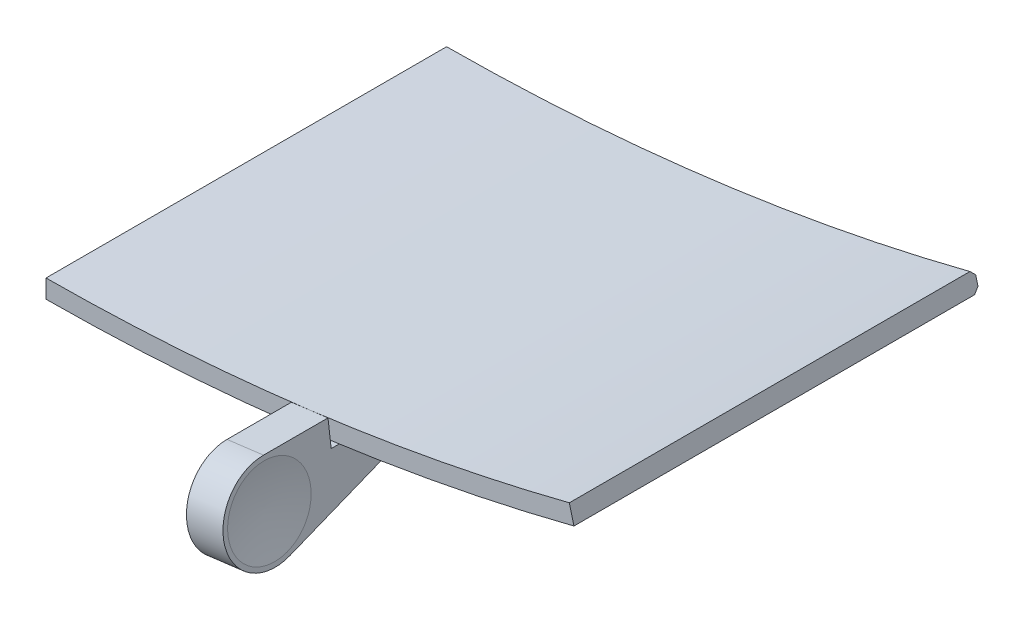
ISO-10303-21;
HEADER;
FILE_DESCRIPTION(('STEP AP214'),'2;1');
FILE_NAME('part.step','',(''),(''),'','','');
FILE_SCHEMA(('AUTOMOTIVE_DESIGN { 1 0 10303 214 1 1 1 1 }'));
ENDSEC;
DATA;
#1=APPLICATION_CONTEXT('core data for automotive mechanical design processes');
#2=APPLICATION_PROTOCOL_DEFINITION('international standard','automotive_design',2000,#1);
#3=PRODUCT_CONTEXT('',#1,'mechanical');
#4=PRODUCT('Part','Part','',(#3));
#5=PRODUCT_RELATED_PRODUCT_CATEGORY('part','',(#4));
#6=PRODUCT_DEFINITION_FORMATION('','',#4);
#7=PRODUCT_DEFINITION_CONTEXT('part definition',#1,'design');
#8=PRODUCT_DEFINITION('design','',#6,#7);
#9=PRODUCT_DEFINITION_SHAPE('','',#8);
#10=(LENGTH_UNIT() NAMED_UNIT(*) SI_UNIT(.MILLI.,.METRE.));
#11=(NAMED_UNIT(*) PLANE_ANGLE_UNIT() SI_UNIT($,.RADIAN.));
#12=(NAMED_UNIT(*) SI_UNIT($,.STERADIAN.) SOLID_ANGLE_UNIT());
#13=UNCERTAINTY_MEASURE_WITH_UNIT(LENGTH_MEASURE(1.E-05),#10,'distance_accuracy_value','');
#14=(GEOMETRIC_REPRESENTATION_CONTEXT(3) GLOBAL_UNCERTAINTY_ASSIGNED_CONTEXT((#13)) GLOBAL_UNIT_ASSIGNED_CONTEXT((#10,
#11,#12)) REPRESENTATION_CONTEXT('',''));
#15=CARTESIAN_POINT('',(0.,0.,0.));
#16=DIRECTION('',(0.,0.,1.));
#17=DIRECTION('',(1.,0.,0.));
#18=AXIS2_PLACEMENT_3D('',#15,#16,#17);
#19=CARTESIAN_POINT('',(0.,0.,44.));
#20=DIRECTION('',(0.,0.,1.));
#21=DIRECTION('',(1.,0.,0.));
#22=AXIS2_PLACEMENT_3D('',#19,#20,#21);
#23=PLANE('',#22);
#24=DIRECTION('',(-0.991905527292072,-0.126978048998387,0.));
#25=VECTOR('',#24,1.);
#26=CARTESIAN_POINT('',(31.8236525692054,-232.843842815643,44.));
#27=LINE('',#26,#25);
#28=CARTESIAN_POINT('',(31.8236525692054,-232.843842815643,44.));
#29=VERTEX_POINT('',#28);
#30=CARTESIAN_POINT('',(29.8398415146213,-233.097798913639,44.));
#31=VERTEX_POINT('',#30);
#32=EDGE_CURVE('E65',#29,#31,#27,.T.);
#33=ORIENTED_EDGE('',*,*,#32,.F.);
#34=DIRECTION('',(0.126978048998387,-0.991905527292072,0.));
#35=VECTOR('',#34,1.);
#36=CARTESIAN_POINT('',(32.1704258400996,-235.552707275527,44.));
#37=LINE('',#36,#35);
#38=CARTESIAN_POINT('',(32.0765371034071,-234.819283210419,44.));
#39=VERTEX_POINT('',#38);
#40=EDGE_CURVE('E183',#29,#39,#37,.T.);
#41=ORIENTED_EDGE('',*,*,#40,.T.);
#42=CARTESIAN_POINT('',(0.,0.,44.));
#43=DIRECTION('',(0.,0.,1.));
#44=DIRECTION('',(1.,0.,0.));
#45=AXIS2_PLACEMENT_3D('',#42,#43,#44);
#46=CIRCLE('',#45,237.000000000002);
#47=CARTESIAN_POINT('',(58.5383393260251,-229.65683710474,44.));
#48=VERTEX_POINT('',#47);
#49=EDGE_CURVE('E471',#39,#48,#46,.T.);
#50=ORIENTED_EDGE('',*,*,#49,.T.);
#51=DIRECTION('',(0.251900457292527,-0.967753150145126,0.));
#52=VECTOR('',#51,1.);
#53=CARTESIAN_POINT('',(58.0345318984008,-227.721305782605,44.));
#54=LINE('',#53,#52);
#55=CARTESIAN_POINT('',(58.0345318984008,-227.721305782605,44.));
#56=VERTEX_POINT('',#55);
#57=EDGE_CURVE('E227',#56,#48,#54,.T.);
#58=ORIENTED_EDGE('',*,*,#57,.F.);
#59=CARTESIAN_POINT('',(0.,0.,44.));
#60=DIRECTION('',(0.,0.,-1.));
#61=DIRECTION('',(1.,0.,0.));
#62=AXIS2_PLACEMENT_3D('',#59,#60,#61);
#63=CIRCLE('',#62,235.000000000003);
#64=EDGE_CURVE('E480',#56,#31,#63,.T.);
#65=ORIENTED_EDGE('',*,*,#64,.T.);
#66=EDGE_LOOP('',(#33,#41,#50,#58,#65));
#67=FACE_BOUND('',#66,.T.);
#68=ADVANCED_FACE('F47',(#67),#23,.T.);
#69=CARTESIAN_POINT('',(0.,0.,44.));
#70=DIRECTION('',(0.,0.,-1.));
#71=DIRECTION('',(-1.,0.,0.));
#72=AXIS2_PLACEMENT_3D('',#69,#70,#71);
#73=CYLINDRICAL_SURFACE('',#72,235.000000000003);
#74=CARTESIAN_POINT('',(0.,0.,0.500000000000056));
#75=DIRECTION('',(0.,0.,1.));
#76=DIRECTION('',(1.,0.,0.));
#77=AXIS2_PLACEMENT_3D('',#74,#75,#76);
#78=CIRCLE('',#77,235.000000000003);
#79=CARTESIAN_POINT('',(58.0345318984008,-227.721305782605,0.500000000000071));
#80=VERTEX_POINT('',#79);
#81=CARTESIAN_POINT('',(1.2,-234.996936150243,0.500000000000071));
#82=VERTEX_POINT('',#81);
#83=EDGE_CURVE('E282',#80,#82,#78,.F.);
#84=ORIENTED_EDGE('',*,*,#83,.T.);
#85=DIRECTION('',(0.,0.,1.));
#86=VECTOR('',#85,1.);
#87=CARTESIAN_POINT('',(1.2,-234.996936150243,0.));
#88=LINE('',#87,#86);
#89=CARTESIAN_POINT('',(1.2,-234.996936150243,44.));
#90=VERTEX_POINT('',#89);
#91=EDGE_CURVE('E228',#82,#90,#88,.T.);
#92=ORIENTED_EDGE('',*,*,#91,.T.);
#93=EDGE_CURVE('E456',#31,#90,#63,.T.);
#94=ORIENTED_EDGE('',*,*,#93,.F.);
#95=ORIENTED_EDGE('',*,*,#64,.F.);
#96=DIRECTION('',(0.,0.,1.));
#97=VECTOR('',#96,1.);
#98=CARTESIAN_POINT('',(58.0345318984008,-227.721305782605,0.));
#99=LINE('',#98,#97);
#100=EDGE_CURVE('E235',#80,#56,#99,.T.);
#101=ORIENTED_EDGE('',*,*,#100,.F.);
#102=EDGE_LOOP('',(#84,#92,#94,#95,#101));
#103=FACE_BOUND('',#102,.T.);
#104=ADVANCED_FACE('F295',(#103),#73,.F.);
#105=CARTESIAN_POINT('',(0.,0.,44.));
#106=DIRECTION('',(0.,0.,-1.));
#107=DIRECTION('',(-1.,0.,0.));
#108=AXIS2_PLACEMENT_3D('',#105,#106,#107);
#109=CYLINDRICAL_SURFACE('',#108,237.000000000002);
#110=CARTESIAN_POINT('',(1.2,-236.996962005849,44.));
#111=VERTEX_POINT('',#110);
#112=CARTESIAN_POINT('',(28.1089149942388,-235.327195406412,44.));
#113=VERTEX_POINT('',#112);
#114=EDGE_CURVE('E463',#111,#113,#46,.T.);
#115=ORIENTED_EDGE('',*,*,#114,.F.);
#116=DIRECTION('',(0.,0.,1.));
#117=VECTOR('',#116,1.);
#118=CARTESIAN_POINT('',(1.2,-236.996962005849,0.));
#119=LINE('',#118,#117);
#120=CARTESIAN_POINT('',(1.2,-236.996962005849,0.50000000000161));
#121=VERTEX_POINT('',#120);
#122=EDGE_CURVE('E222',#121,#111,#119,.T.);
#123=ORIENTED_EDGE('',*,*,#122,.F.);
#124=CARTESIAN_POINT('',(0.,0.,0.500000000000056));
#125=DIRECTION('',(0.,0.,1.));
#126=DIRECTION('',(1.,0.,0.));
#127=AXIS2_PLACEMENT_3D('',#124,#125,#126);
#128=CIRCLE('',#127,237.000000000002);
#129=CARTESIAN_POINT('',(58.5383393260246,-229.656837104738,0.500000000000056));
#130=VERTEX_POINT('',#129);
#131=EDGE_CURVE('E467',#121,#130,#128,.T.);
#132=ORIENTED_EDGE('',*,*,#131,.T.);
#133=DIRECTION('',(0.,0.,1.));
#134=VECTOR('',#133,1.);
#135=CARTESIAN_POINT('',(58.5383393260251,-229.65683710474,0.));
#136=LINE('',#135,#134);
#137=EDGE_CURVE('E205',#130,#48,#136,.T.);
#138=ORIENTED_EDGE('',*,*,#137,.T.);
#139=ORIENTED_EDGE('',*,*,#49,.F.);
#140=EDGE_CURVE('E469',#113,#39,#46,.T.);
#141=ORIENTED_EDGE('',*,*,#140,.F.);
#142=EDGE_LOOP('',(#115,#123,#132,#138,#139,#141));
#143=FACE_BOUND('',#142,.T.);
#144=ADVANCED_FACE('F299',(#143),#109,.T.);
#145=DIRECTION('',(-0.991905527292072,-0.126978048998387,0.));
#146=VECTOR('',#145,1.);
#147=CARTESIAN_POINT('',(29.8398415146213,-233.097798913639,44.));
#148=LINE('',#147,#146);
#149=CARTESIAN_POINT('',(27.8560304600371,-233.351755011636,44.));
#150=VERTEX_POINT('',#149);
#151=EDGE_CURVE('E11',#31,#150,#148,.T.);
#152=ORIENTED_EDGE('',*,*,#151,.F.);
#153=ORIENTED_EDGE('',*,*,#93,.T.);
#154=DIRECTION('',(0.,1.,0.));
#155=VECTOR('',#154,1.);
#156=CARTESIAN_POINT('',(1.2,-234.996936150243,44.));
#157=LINE('',#156,#155);
#158=EDGE_CURVE('E223',#111,#90,#157,.T.);
#159=ORIENTED_EDGE('',*,*,#158,.F.);
#160=ORIENTED_EDGE('',*,*,#114,.T.);
#161=DIRECTION('',(0.126978048998387,-0.991905527292072,0.));
#162=VECTOR('',#161,1.);
#163=CARTESIAN_POINT('',(28.2028037309314,-236.06061947152,44.));
#164=LINE('',#163,#162);
#165=EDGE_CURVE('E73',#150,#113,#164,.T.);
#166=ORIENTED_EDGE('',*,*,#165,.F.);
#167=EDGE_LOOP('',(#152,#153,#159,#160,#166));
#168=FACE_BOUND('',#167,.T.);
#169=ADVANCED_FACE('F271',(#168),#23,.T.);
#170=CARTESIAN_POINT('',(0.,0.,0.));
#171=DIRECTION('',(0.,0.,1.));
#172=DIRECTION('',(1.,0.,0.));
#173=AXIS2_PLACEMENT_3D('',#170,#171,#172);
#174=PLANE('',#173);
#175=CARTESIAN_POINT('',(0.,0.,0.));
#176=DIRECTION('',(0.,0.,1.));
#177=DIRECTION('',(1.,0.,0.));
#178=AXIS2_PLACEMENT_3D('',#175,#176,#177);
#179=CIRCLE('',#178,236.500000000002);
#180=CARTESIAN_POINT('',(58.412387479446,-229.172954313881,0.));
#181=VERTEX_POINT('',#180);
#182=CARTESIAN_POINT('',(1.2,-236.496955582944,0.));
#183=VERTEX_POINT('',#182);
#184=EDGE_CURVE('E460',#181,#183,#179,.F.);
#185=ORIENTED_EDGE('',*,*,#184,.T.);
#186=DIRECTION('',(0.,1.,0.));
#187=VECTOR('',#186,1.);
#188=CARTESIAN_POINT('',(1.2,-234.996936150243,0.));
#189=LINE('',#188,#187);
#190=CARTESIAN_POINT('',(1.2,-235.496942655316,0.));
#191=VERTEX_POINT('',#190);
#192=EDGE_CURVE('E218',#183,#191,#189,.T.);
#193=ORIENTED_EDGE('',*,*,#192,.T.);
#194=CARTESIAN_POINT('',(0.,0.,0.));
#195=DIRECTION('',(0.,0.,1.));
#196=DIRECTION('',(1.,0.,0.));
#197=AXIS2_PLACEMENT_3D('',#194,#195,#196);
#198=CIRCLE('',#197,235.500000000003);
#199=CARTESIAN_POINT('',(58.160483765678,-228.205188652983,0.));
#200=VERTEX_POINT('',#199);
#201=EDGE_CURVE('E458',#191,#200,#198,.T.);
#202=ORIENTED_EDGE('',*,*,#201,.T.);
#203=DIRECTION('',(0.251900457292527,-0.967753150145126,0.));
#204=VECTOR('',#203,1.);
#205=CARTESIAN_POINT('',(58.0345318984008,-227.721305782605,0.));
#206=LINE('',#205,#204);
#207=EDGE_CURVE('E238',#200,#181,#206,.T.);
#208=ORIENTED_EDGE('',*,*,#207,.T.);
#209=EDGE_LOOP('',(#185,#193,#202,#208));
#210=FACE_BOUND('',#209,.T.);
#211=ADVANCED_FACE('F303',(#210),#174,.F.);
#212=CARTESIAN_POINT('',(0.,0.,0.500000000000056));
#213=DIRECTION('',(0.,0.,-1.));
#214=DIRECTION('',(-1.,0.,0.));
#215=AXIS2_PLACEMENT_3D('',#212,#213,#214);
#216=CONICAL_SURFACE('',#215,235.000000000003,0.785398163397421);
#217=CARTESIAN_POINT('',(1.2,-234.287826686691,1.20910019044327));
#218=CARTESIAN_POINT('',(1.2,-234.607530926539,0.889400143920178));
#219=CARTESIAN_POINT('',(1.2,-234.927235157908,0.569700088918097));
#220=CARTESIAN_POINT('',(1.2,-235.566643603689,-0.0697000380440554));
#221=CARTESIAN_POINT('',(1.2,-235.8863478181,-0.389400110004127));
#222=CARTESIAN_POINT('',(1.2,-236.206052024033,-0.709100190443191));
#223=B_SPLINE_CURVE_WITH_KNOTS('',3,(#217,#218,#219,#220,#221,#222),.UNSPECIFIED.,.F.,.F.,(4,2,
4),(0.,1.35638132046746,2.71276264093494),.UNSPECIFIED.);
#224=EDGE_CURVE('E255',#82,#191,#223,.T.);
#225=ORIENTED_EDGE('',*,*,#224,.F.);
#226=ORIENTED_EDGE('',*,*,#83,.F.);
#227=CARTESIAN_POINT('',(58.1605341464236,-228.205382206126,-0.000200000000002843));
#228=CARTESIAN_POINT('',(58.139525095573,-228.124669469989,0.0832011114169551));
#229=CARTESIAN_POINT('',(58.1185160445772,-228.043956733294,0.166602222256886));
#230=CARTESIAN_POINT('',(58.0764979422947,-227.882531258787,0.33340444278269));
#231=CARTESIAN_POINT('',(58.0554888910082,-227.801818520975,0.416805552468562));
#232=CARTESIAN_POINT('',(58.0344798395762,-227.721105782605,0.500206661577408));
#233=B_SPLINE_CURVE_WITH_KNOTS('',3,(#227,#228,#229,#230,#231,#232),.UNSPECIFIED.,.F.,.F.,(4,2,
4),(0.,0.353843245521176,0.707686491042329),.UNSPECIFIED.);
#234=EDGE_CURVE('E232',#200,#80,#233,.T.);
#235=ORIENTED_EDGE('',*,*,#234,.F.);
#236=ORIENTED_EDGE('',*,*,#201,.F.);
#237=EDGE_LOOP('',(#225,#226,#235,#236));
#238=FACE_BOUND('',#237,.T.);
#239=ADVANCED_FACE('F50',(#238),#216,.F.);
#240=CARTESIAN_POINT('',(0.,0.,0.500000000000056));
#241=DIRECTION('',(0.,0.,1.));
#242=DIRECTION('',(1.,0.,0.));
#243=AXIS2_PLACEMENT_3D('',#240,#241,#242);
#244=CONICAL_SURFACE('',#243,237.000000000002,0.785398163397421);
#245=CARTESIAN_POINT('',(1.2,-234.435150911886,-2.06177789644154));
#246=CARTESIAN_POINT('',(1.2,-235.205749173621,-1.29118972780455));
#247=CARTESIAN_POINT('',(1.2,-235.976347387022,-0.520601510833104));
#248=CARTESIAN_POINT('',(1.2,-237.517543717157,1.02057501977868));
#249=CARTESIAN_POINT('',(1.2,-238.288141833891,1.79116333341903));
#250=CARTESIAN_POINT('',(1.2,-239.058739902291,2.56175169539382));
#251=B_SPLINE_CURVE_WITH_KNOTS('',3,(#245,#246,#247,#248,#249,#250),.UNSPECIFIED.,.F.,.F.,(4,2,
4),(0.,3.26935012803671,6.53870025607345),.UNSPECIFIED.);
#252=EDGE_CURVE('E58',#183,#121,#251,.T.);
#253=ORIENTED_EDGE('',*,*,#252,.F.);
#254=ORIENTED_EDGE('',*,*,#184,.F.);
#255=CARTESIAN_POINT('',(58.5383913848496,-229.65703710474,0.500206661624564));
#256=CARTESIAN_POINT('',(58.5173823374442,-229.576324381839,0.416805550221544));
#257=CARTESIAN_POINT('',(58.4963732898963,-229.49561165839,0.333404439384654));
#258=CARTESIAN_POINT('',(58.4543551945151,-229.334186210397,0.166602218843129));
#259=CARTESIAN_POINT('',(58.4333461466819,-229.253473485852,0.0832011091384947));
#260=CARTESIAN_POINT('',(58.4123370987061,-229.172760760759,-0.000200000000010288));
#261=B_SPLINE_CURVE_WITH_KNOTS('',3,(#255,#256,#257,#258,#259,#260),.UNSPECIFIED.,.F.,.F.,(4,2,
4),(0.,0.353843216479014,0.707686432958038),.UNSPECIFIED.);
#262=EDGE_CURVE('E275',#130,#181,#261,.T.);
#263=ORIENTED_EDGE('',*,*,#262,.F.);
#264=ORIENTED_EDGE('',*,*,#131,.F.);
#265=EDGE_LOOP('',(#253,#254,#263,#264));
#266=FACE_BOUND('',#265,.T.);
#267=ADVANCED_FACE('F267',(#266),#244,.T.);
#268=CARTESIAN_POINT('',(58.0345318984008,-227.721305782605,0.));
#269=DIRECTION('',(-0.967753150145127,-0.251900457292527,0.));
#270=DIRECTION('',(0.251900457292527,-0.967753150145127,0.));
#271=AXIS2_PLACEMENT_3D('',#268,#269,#270);
#272=PLANE('',#271);
#273=ORIENTED_EDGE('',*,*,#234,.T.);
#274=ORIENTED_EDGE('',*,*,#100,.T.);
#275=ORIENTED_EDGE('',*,*,#57,.T.);
#276=ORIENTED_EDGE('',*,*,#137,.F.);
#277=ORIENTED_EDGE('',*,*,#262,.T.);
#278=ORIENTED_EDGE('',*,*,#207,.F.);
#279=EDGE_LOOP('',(#273,#274,#275,#276,#277,#278));
#280=FACE_BOUND('',#279,.T.);
#281=ADVANCED_FACE('F262',(#280),#272,.F.);
#282=CARTESIAN_POINT('',(1.2,-234.996936150243,0.));
#283=DIRECTION('',(1.,0.,0.));
#284=DIRECTION('',(0.,0.,-1.));
#285=AXIS2_PLACEMENT_3D('',#282,#283,#284);
#286=PLANE('',#285);
#287=ORIENTED_EDGE('',*,*,#224,.T.);
#288=ORIENTED_EDGE('',*,*,#192,.F.);
#289=ORIENTED_EDGE('',*,*,#252,.T.);
#290=ORIENTED_EDGE('',*,*,#122,.T.);
#291=ORIENTED_EDGE('',*,*,#158,.T.);
#292=ORIENTED_EDGE('',*,*,#91,.F.);
#293=EDGE_LOOP('',(#287,#288,#289,#290,#291,#292));
#294=FACE_BOUND('',#293,.T.);
#295=ADVANCED_FACE('F266',(#294),#286,.F.);
#296=CARTESIAN_POINT('',(32.1704258400996,-235.552707275527,44.));
#297=DIRECTION('',(0.,0.,-1.));
#298=DIRECTION('',(-1.,0.,0.));
#299=AXIS2_PLACEMENT_3D('',#296,#297,#298);
#300=PLANE('',#299);
#301=ORIENTED_EDGE('',*,*,#140,.T.);
#302=CARTESIAN_POINT('',(32.1704258400996,-235.552707275527,44.));
#303=VERTEX_POINT('',#302);
#304=EDGE_CURVE('E182',#39,#303,#37,.T.);
#305=ORIENTED_EDGE('',*,*,#304,.T.);
#306=DIRECTION('',(-0.991905527292072,-0.126978048998387,0.));
#307=VECTOR('',#306,1.);
#308=CARTESIAN_POINT('',(32.1704258400996,-235.552707275527,44.));
#309=LINE('',#308,#307);
#310=CARTESIAN_POINT('',(28.2028037309314,-236.06061947152,44.));
#311=VERTEX_POINT('',#310);
#312=EDGE_CURVE('E202',#303,#311,#309,.T.);
#313=ORIENTED_EDGE('',*,*,#312,.T.);
#314=EDGE_CURVE('E156',#113,#311,#164,.T.);
#315=ORIENTED_EDGE('',*,*,#314,.F.);
#316=EDGE_LOOP('',(#301,#305,#313,#315));
#317=FACE_BOUND('',#316,.T.);
#318=ADVANCED_FACE('F338',(#317),#300,.T.);
#319=CARTESIAN_POINT('',(31.8236525692054,-232.843842815643,44.));
#320=DIRECTION('',(-0.126978048998387,0.991905527292072,0.));
#321=DIRECTION('',(-0.991905527292072,-0.126978048998387,0.));
#322=AXIS2_PLACEMENT_3D('',#319,#320,#321);
#323=PLANE('',#322);
#324=ORIENTED_EDGE('',*,*,#32,.T.);
#325=ORIENTED_EDGE('',*,*,#151,.T.);
#326=DIRECTION('',(0.,0.,-1.));
#327=VECTOR('',#326,1.);
#328=CARTESIAN_POINT('',(27.8560304600371,-233.351755011636,44.));
#329=LINE('',#328,#327);
#330=CARTESIAN_POINT('',(27.8560304600371,-233.351755011636,51.));
#331=VERTEX_POINT('',#330);
#332=EDGE_CURVE('E178',#331,#150,#329,.T.);
#333=ORIENTED_EDGE('',*,*,#332,.F.);
#334=DIRECTION('',(-0.991905527292072,-0.126978048998387,0.));
#335=VECTOR('',#334,1.);
#336=CARTESIAN_POINT('',(31.8236525692054,-232.843842815643,51.));
#337=LINE('',#336,#335);
#338=CARTESIAN_POINT('',(31.8236525692054,-232.843842815643,51.));
#339=VERTEX_POINT('',#338);
#340=EDGE_CURVE('E206',#339,#331,#337,.T.);
#341=ORIENTED_EDGE('',*,*,#340,.F.);
#342=DIRECTION('',(0.,0.,-1.));
#343=VECTOR('',#342,1.);
#344=CARTESIAN_POINT('',(31.8236525692054,-232.843842815643,44.));
#345=LINE('',#344,#343);
#346=EDGE_CURVE('E198',#339,#29,#345,.T.);
#347=ORIENTED_EDGE('',*,*,#346,.T.);
#348=EDGE_LOOP('',(#324,#325,#333,#341,#347));
#349=FACE_BOUND('',#348,.T.);
#350=ADVANCED_FACE('F341',(#349),#323,.T.);
#351=CARTESIAN_POINT('',(32.4585428141974,-237.803370452103,51.));
#352=DIRECTION('',(-0.991905527292072,-0.126978048998387,0.));
#353=DIRECTION('',(0.126978048998387,-0.991905527292072,0.));
#354=AXIS2_PLACEMENT_3D('',#351,#352,#353);
#355=CYLINDRICAL_SURFACE('',#354,5.);
#356=ORIENTED_EDGE('',*,*,#340,.T.);
#357=CARTESIAN_POINT('',(28.4909207050291,-238.311282648097,51.));
#358=DIRECTION('',(-0.991905527292072,-0.126978048998387,0.));
#359=DIRECTION('',(0.126978048998387,-0.991905527292072,0.));
#360=AXIS2_PLACEMENT_3D('',#357,#358,#359);
#361=CIRCLE('',#360,5.);
#362=CARTESIAN_POINT('',(29.0913850135941,-243.00188760939,49.3759101899141));
#363=VERTEX_POINT('',#362);
#364=EDGE_CURVE('E174',#363,#331,#361,.T.);
#365=ORIENTED_EDGE('',*,*,#364,.F.);
#366=DIRECTION('',(-0.991905527292072,-0.126978048998387,0.));
#367=VECTOR('',#366,1.);
#368=CARTESIAN_POINT('',(33.0590071227624,-242.493975413397,49.3759101899141));
#369=LINE('',#368,#367);
#370=CARTESIAN_POINT('',(33.0590071227624,-242.493975413397,49.3759101899141));
#371=VERTEX_POINT('',#370);
#372=EDGE_CURVE('E209',#371,#363,#369,.T.);
#373=ORIENTED_EDGE('',*,*,#372,.F.);
#374=CARTESIAN_POINT('',(32.4585428141974,-237.803370452103,51.));
#375=DIRECTION('',(-0.991905527292072,-0.126978048998387,0.));
#376=DIRECTION('',(0.126978048998387,-0.991905527292072,0.));
#377=AXIS2_PLACEMENT_3D('',#374,#375,#376);
#378=CIRCLE('',#377,5.);
#379=EDGE_CURVE('E194',#371,#339,#378,.T.);
#380=ORIENTED_EDGE('',*,*,#379,.T.);
#381=EDGE_LOOP('',(#356,#365,#373,#380));
#382=FACE_BOUND('',#381,.T.);
#383=ADVANCED_FACE('F349',(#382),#355,.T.);
#384=CARTESIAN_POINT('',(32.1704258400996,-235.552707275527,29.));
#385=DIRECTION('',(0.120092861713004,-0.938120992258778,-0.324817962017169));
#386=DIRECTION('',(0.,0.327185916838288,-0.944959986360633));
#387=AXIS2_PLACEMENT_3D('',#384,#385,#386);
#388=PLANE('',#387);
#389=ORIENTED_EDGE('',*,*,#372,.T.);
#390=DIRECTION('',(0.0412447510965724,-0.322188731888576,0.945776554769155));
#391=VECTOR('',#390,1.);
#392=CARTESIAN_POINT('',(28.2028037309314,-236.06061947152,29.));
#393=LINE('',#392,#391);
#394=CARTESIAN_POINT('',(28.2028037309314,-236.06061947152,29.));
#395=VERTEX_POINT('',#394);
#396=EDGE_CURVE('E170',#395,#363,#393,.T.);
#397=ORIENTED_EDGE('',*,*,#396,.F.);
#398=DIRECTION('',(-0.991905527292072,-0.126978048998387,0.));
#399=VECTOR('',#398,1.);
#400=CARTESIAN_POINT('',(32.1704258400996,-235.552707275527,29.));
#401=LINE('',#400,#399);
#402=CARTESIAN_POINT('',(32.1704258400996,-235.552707275527,29.));
#403=VERTEX_POINT('',#402);
#404=EDGE_CURVE('E212',#403,#395,#401,.T.);
#405=ORIENTED_EDGE('',*,*,#404,.F.);
#406=DIRECTION('',(0.0412447510965724,-0.322188731888576,0.945776554769155));
#407=VECTOR('',#406,1.);
#408=CARTESIAN_POINT('',(32.1704258400996,-235.552707275527,29.));
#409=LINE('',#408,#407);
#410=EDGE_CURVE('E190',#403,#371,#409,.T.);
#411=ORIENTED_EDGE('',*,*,#410,.T.);
#412=EDGE_LOOP('',(#389,#397,#405,#411));
#413=FACE_BOUND('',#412,.T.);
#414=ADVANCED_FACE('F358',(#413),#388,.T.);
#415=CARTESIAN_POINT('',(32.1704258400996,-235.552707275527,29.));
#416=DIRECTION('',(-0.126978048998387,0.991905527292072,0.));
#417=DIRECTION('',(-0.991905527292072,-0.126978048998387,0.));
#418=AXIS2_PLACEMENT_3D('',#415,#416,#417);
#419=PLANE('',#418);
#420=ORIENTED_EDGE('',*,*,#404,.T.);
#421=DIRECTION('',(0.,0.,-1.));
#422=VECTOR('',#421,1.);
#423=CARTESIAN_POINT('',(28.2028037309314,-236.06061947152,29.));
#424=LINE('',#423,#422);
#425=EDGE_CURVE('E166',#311,#395,#424,.T.);
#426=ORIENTED_EDGE('',*,*,#425,.F.);
#427=ORIENTED_EDGE('',*,*,#312,.F.);
#428=DIRECTION('',(0.,0.,-1.));
#429=VECTOR('',#428,1.);
#430=CARTESIAN_POINT('',(32.1704258400996,-235.552707275527,29.));
#431=LINE('',#430,#429);
#432=EDGE_CURVE('E186',#303,#403,#431,.T.);
#433=ORIENTED_EDGE('',*,*,#432,.T.);
#434=EDGE_LOOP('',(#420,#426,#427,#433));
#435=FACE_BOUND('',#434,.T.);
#436=ADVANCED_FACE('F367',(#435),#419,.T.);
#437=CARTESIAN_POINT('',(32.4585428141974,-237.803370452103,51.));
#438=DIRECTION('',(-0.991905527292072,-0.126978048998387,0.));
#439=DIRECTION('',(0.126978048998387,-0.991905527292072,0.));
#440=AXIS2_PLACEMENT_3D('',#437,#438,#439);
#441=PLANE('',#440);
#442=CARTESIAN_POINT('',(32.4585428141974,-237.803370452103,51.));
#443=DIRECTION('',(0.991905527292072,0.126978048998387,0.));
#444=DIRECTION('',(-0.126978048998387,0.991905527292072,0.));
#445=AXIS2_PLACEMENT_3D('',#442,#443,#444);
#446=CIRCLE('',#445,4.5);
#447=CARTESIAN_POINT('',(31.8871415937046,-233.339795579289,51.));
#448=VERTEX_POINT('',#447);
#449=EDGE_CURVE('E153',#448,#448,#446,.T.);
#450=ORIENTED_EDGE('',*,*,#449,.F.);
#451=EDGE_LOOP('',(#450));
#452=FACE_BOUND('',#451,.T.);
#453=ORIENTED_EDGE('',*,*,#40,.F.);
#454=ORIENTED_EDGE('',*,*,#346,.F.);
#455=ORIENTED_EDGE('',*,*,#379,.F.);
#456=ORIENTED_EDGE('',*,*,#410,.F.);
#457=ORIENTED_EDGE('',*,*,#432,.F.);
#458=ORIENTED_EDGE('',*,*,#304,.F.);
#459=EDGE_LOOP('',(#453,#454,#455,#456,#457,#458));
#460=FACE_BOUND('',#459,.T.);
#461=ADVANCED_FACE('F376',(#452,#460),#441,.F.);
#462=CARTESIAN_POINT('',(28.4909207050291,-238.311282648097,51.));
#463=DIRECTION('',(-0.991905527292072,-0.126978048998387,0.));
#464=DIRECTION('',(0.126978048998387,-0.991905527292072,0.));
#465=AXIS2_PLACEMENT_3D('',#462,#463,#464);
#466=PLANE('',#465);
#467=CARTESIAN_POINT('',(28.4909207050291,-238.311282648097,51.));
#468=DIRECTION('',(0.991905527292072,0.126978048998387,0.));
#469=DIRECTION('',(-0.126978048998387,0.991905527292072,0.));
#470=AXIS2_PLACEMENT_3D('',#467,#468,#469);
#471=CIRCLE('',#470,4.5);
#472=CARTESIAN_POINT('',(27.9195194845363,-233.847707775282,51.));
#473=VERTEX_POINT('',#472);
#474=EDGE_CURVE('E157',#473,#473,#471,.T.);
#475=ORIENTED_EDGE('',*,*,#474,.T.);
#476=EDGE_LOOP('',(#475));
#477=FACE_BOUND('',#476,.T.);
#478=ORIENTED_EDGE('',*,*,#165,.T.);
#479=ORIENTED_EDGE('',*,*,#314,.T.);
#480=ORIENTED_EDGE('',*,*,#425,.T.);
#481=ORIENTED_EDGE('',*,*,#396,.T.);
#482=ORIENTED_EDGE('',*,*,#364,.T.);
#483=ORIENTED_EDGE('',*,*,#332,.T.);
#484=EDGE_LOOP('',(#478,#479,#480,#481,#482,#483));
#485=FACE_BOUND('',#484,.T.);
#486=ADVANCED_FACE('F385',(#477,#485),#466,.T.);
#487=CARTESIAN_POINT('',(9.29923170429515,-241.147357286115,51.));
#488=DIRECTION('',(0.,0.,-1.));
#489=DIRECTION('',(-0.126978048998387,0.991905527292072,0.));
#490=AXIS2_PLACEMENT_3D('',#487,#488,#489);
#491=CIRCLE('',#490,20.);
#492=TRIMMED_CURVE('',#491,(PARAMETER_VALUE(-1.55198547330173)),
(PARAMETER_VALUE(1.55198547330173)),.T.,.PARAMETER.);
#493=CARTESIAN_POINT('',(9.2514632120129,-240.774207502362,51.));
#494=DIRECTION('',(0.991905527292072,0.126978048998387,0.));
#495=AXIS1_PLACEMENT('',#493,#494);
#496=SURFACE_OF_REVOLUTION('',#492,#495);
#497=ORIENTED_EDGE('',*,*,#474,.F.);
#498=EDGE_LOOP('',(#497));
#499=FACE_BOUND('',#498,.T.);
#500=CARTESIAN_POINT('',(29.0860640214043,-238.235095818698,51.));
#501=VERTEX_POINT('',#500);
#502=VERTEX_LOOP('',#501);
#503=FACE_BOUND('',#502,.T.);
#504=ADVANCED_FACE('F149',(#499,#503),#496,.F.);
#505=CARTESIAN_POINT('',(51.7457687994958,-235.713595381591,51.));
#506=DIRECTION('',(0.,0.,-1.));
#507=DIRECTION('',(-0.126978048998387,0.991905527292072,0.));
#508=AXIS2_PLACEMENT_3D('',#505,#506,#507);
#509=CIRCLE('',#508,20.);
#510=TRIMMED_CURVE('',#509,(PARAMETER_VALUE(-1.55198547330173)),
(PARAMETER_VALUE(1.55198547330173)),.T.,.PARAMETER.);
#511=CARTESIAN_POINT('',(51.6980003072135,-235.340445597838,51.));
#512=DIRECTION('',(0.991905527292072,0.126978048998387,0.));
#513=AXIS1_PLACEMENT('',#511,#512);
#514=SURFACE_OF_REVOLUTION('',#510,#513);
#515=CARTESIAN_POINT('',(31.8633994978221,-237.879557281502,51.));
#516=VERTEX_POINT('',#515);
#517=VERTEX_LOOP('',#516);
#518=FACE_BOUND('',#517,.T.);
#519=ORIENTED_EDGE('',*,*,#449,.T.);
#520=EDGE_LOOP('',(#519));
#521=FACE_BOUND('',#520,.T.);
#522=ADVANCED_FACE('F146',(#518,#521),#514,.F.);
#523=CLOSED_SHELL('',(#68,#104,#144,#169,#211,#239,#267,#281,#295,#318,#350,#383,#414,#436,#461,
#486,#504,#522));
#524=MANIFOLD_SOLID_BREP('B2',#523);
#525=ADVANCED_BREP_SHAPE_REPRESENTATION('',(#18,#524),#14);
#526=SHAPE_DEFINITION_REPRESENTATION(#9,#525);
ENDSEC;
END-ISO-10303-21;
